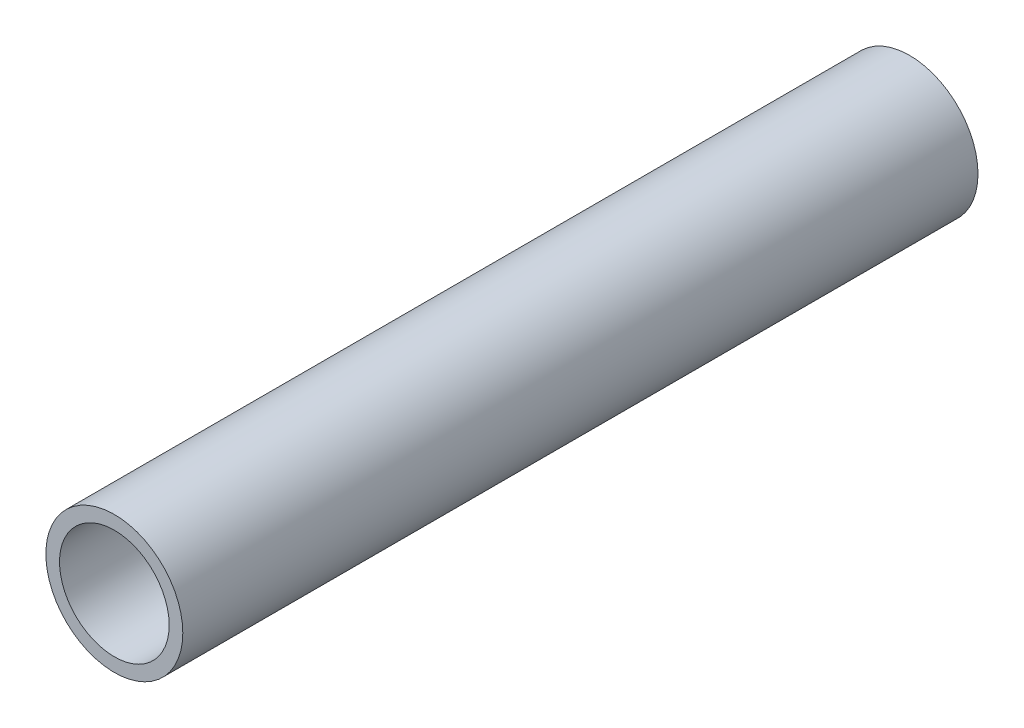
ISO-10303-21;
HEADER;
FILE_DESCRIPTION(('STEP AP214'),'2;1');
FILE_NAME('part.step','',(''),(''),'','','');
FILE_SCHEMA(('AUTOMOTIVE_DESIGN { 1 0 10303 214 1 1 1 1 }'));
ENDSEC;
DATA;
#1=APPLICATION_CONTEXT('core data for automotive mechanical design processes');
#2=APPLICATION_PROTOCOL_DEFINITION('international standard','automotive_design',2000,#1);
#3=PRODUCT_CONTEXT('',#1,'mechanical');
#4=PRODUCT('Part','Part','',(#3));
#5=PRODUCT_RELATED_PRODUCT_CATEGORY('part','',(#4));
#6=PRODUCT_DEFINITION_FORMATION('','',#4);
#7=PRODUCT_DEFINITION_CONTEXT('part definition',#1,'design');
#8=PRODUCT_DEFINITION('design','',#6,#7);
#9=PRODUCT_DEFINITION_SHAPE('','',#8);
#10=(LENGTH_UNIT() NAMED_UNIT(*) SI_UNIT(.MILLI.,.METRE.));
#11=(NAMED_UNIT(*) PLANE_ANGLE_UNIT() SI_UNIT($,.RADIAN.));
#12=(NAMED_UNIT(*) SI_UNIT($,.STERADIAN.) SOLID_ANGLE_UNIT());
#13=UNCERTAINTY_MEASURE_WITH_UNIT(LENGTH_MEASURE(1.E-05),#10,'distance_accuracy_value','');
#14=(GEOMETRIC_REPRESENTATION_CONTEXT(3) GLOBAL_UNCERTAINTY_ASSIGNED_CONTEXT((#13)) GLOBAL_UNIT_ASSIGNED_CONTEXT((#10,
#11,#12)) REPRESENTATION_CONTEXT('',''));
#15=CARTESIAN_POINT('',(0.,0.,0.));
#16=DIRECTION('',(0.,0.,1.));
#17=DIRECTION('',(1.,0.,0.));
#18=AXIS2_PLACEMENT_3D('',#15,#16,#17);
#19=CARTESIAN_POINT('',(0.,0.,185.1025));
#20=DIRECTION('',(0.,0.,1.));
#21=DIRECTION('',(1.,0.,0.));
#22=AXIS2_PLACEMENT_3D('',#19,#20,#21);
#23=PLANE('',#22);
#24=CARTESIAN_POINT('',(0.,0.,185.1025));
#25=DIRECTION('',(0.,0.,1.));
#26=DIRECTION('',(1.,0.,0.));
#27=AXIS2_PLACEMENT_3D('',#24,#25,#26);
#28=CIRCLE('',#27,15.9385);
#29=CARTESIAN_POINT('',(15.9385,0.,185.1025));
#30=VERTEX_POINT('',#29);
#31=EDGE_CURVE('E10',#30,#30,#28,.T.);
#32=ORIENTED_EDGE('',*,*,#31,.T.);
#33=EDGE_LOOP('',(#32));
#34=FACE_BOUND('',#33,.T.);
#35=CARTESIAN_POINT('',(0.,0.,185.1025));
#36=DIRECTION('',(0.,0.,1.));
#37=DIRECTION('',(1.,0.,0.));
#38=AXIS2_PLACEMENT_3D('',#35,#36,#37);
#39=CIRCLE('',#38,12.7635);
#40=CARTESIAN_POINT('',(12.7635,0.,185.1025));
#41=VERTEX_POINT('',#40);
#42=EDGE_CURVE('E50',#41,#41,#39,.T.);
#43=ORIENTED_EDGE('',*,*,#42,.F.);
#44=EDGE_LOOP('',(#43));
#45=FACE_BOUND('',#44,.T.);
#46=ADVANCED_FACE('F39',(#34,#45),#23,.T.);
#47=CARTESIAN_POINT('',(0.,0.,0.));
#48=DIRECTION('',(0.,0.,1.));
#49=DIRECTION('',(1.,0.,0.));
#50=AXIS2_PLACEMENT_3D('',#47,#48,#49);
#51=PLANE('',#50);
#52=CARTESIAN_POINT('',(0.,0.,0.));
#53=DIRECTION('',(0.,0.,1.));
#54=DIRECTION('',(1.,0.,0.));
#55=AXIS2_PLACEMENT_3D('',#52,#53,#54);
#56=CIRCLE('',#55,15.9385);
#57=CARTESIAN_POINT('',(15.9385,0.,0.));
#58=VERTEX_POINT('',#57);
#59=EDGE_CURVE('E43',#58,#58,#56,.T.);
#60=ORIENTED_EDGE('',*,*,#59,.F.);
#61=EDGE_LOOP('',(#60));
#62=FACE_BOUND('',#61,.T.);
#63=CARTESIAN_POINT('',(0.,0.,0.));
#64=DIRECTION('',(0.,0.,1.));
#65=DIRECTION('',(1.,0.,0.));
#66=AXIS2_PLACEMENT_3D('',#63,#64,#65);
#67=CIRCLE('',#66,12.7635);
#68=CARTESIAN_POINT('',(12.7635,0.,0.));
#69=VERTEX_POINT('',#68);
#70=EDGE_CURVE('E52',#69,#69,#67,.T.);
#71=ORIENTED_EDGE('',*,*,#70,.T.);
#72=EDGE_LOOP('',(#71));
#73=FACE_BOUND('',#72,.T.);
#74=ADVANCED_FACE('F62',(#62,#73),#51,.F.);
#75=CARTESIAN_POINT('',(0.,0.,185.1025));
#76=DIRECTION('',(0.,0.,-1.));
#77=DIRECTION('',(-1.,0.,0.));
#78=AXIS2_PLACEMENT_3D('',#75,#76,#77);
#79=CYLINDRICAL_SURFACE('',#78,15.9385);
#80=ORIENTED_EDGE('',*,*,#31,.F.);
#81=EDGE_LOOP('',(#80));
#82=FACE_BOUND('',#81,.T.);
#83=ORIENTED_EDGE('',*,*,#59,.T.);
#84=EDGE_LOOP('',(#83));
#85=FACE_BOUND('',#84,.T.);
#86=ADVANCED_FACE('F41',(#82,#85),#79,.T.);
#87=CARTESIAN_POINT('',(0.,0.,185.1025));
#88=DIRECTION('',(0.,0.,-1.));
#89=DIRECTION('',(-1.,0.,0.));
#90=AXIS2_PLACEMENT_3D('',#87,#88,#89);
#91=CYLINDRICAL_SURFACE('',#90,12.7635);
#92=ORIENTED_EDGE('',*,*,#42,.T.);
#93=EDGE_LOOP('',(#92));
#94=FACE_BOUND('',#93,.T.);
#95=ORIENTED_EDGE('',*,*,#70,.F.);
#96=EDGE_LOOP('',(#95));
#97=FACE_BOUND('',#96,.T.);
#98=ADVANCED_FACE('F58',(#94,#97),#91,.F.);
#99=CLOSED_SHELL('',(#46,#74,#86,#98));
#100=MANIFOLD_SOLID_BREP('B2',#99);
#101=ADVANCED_BREP_SHAPE_REPRESENTATION('',(#18,#100),#14);
#102=SHAPE_DEFINITION_REPRESENTATION(#9,#101);
ENDSEC;
END-ISO-10303-21;
